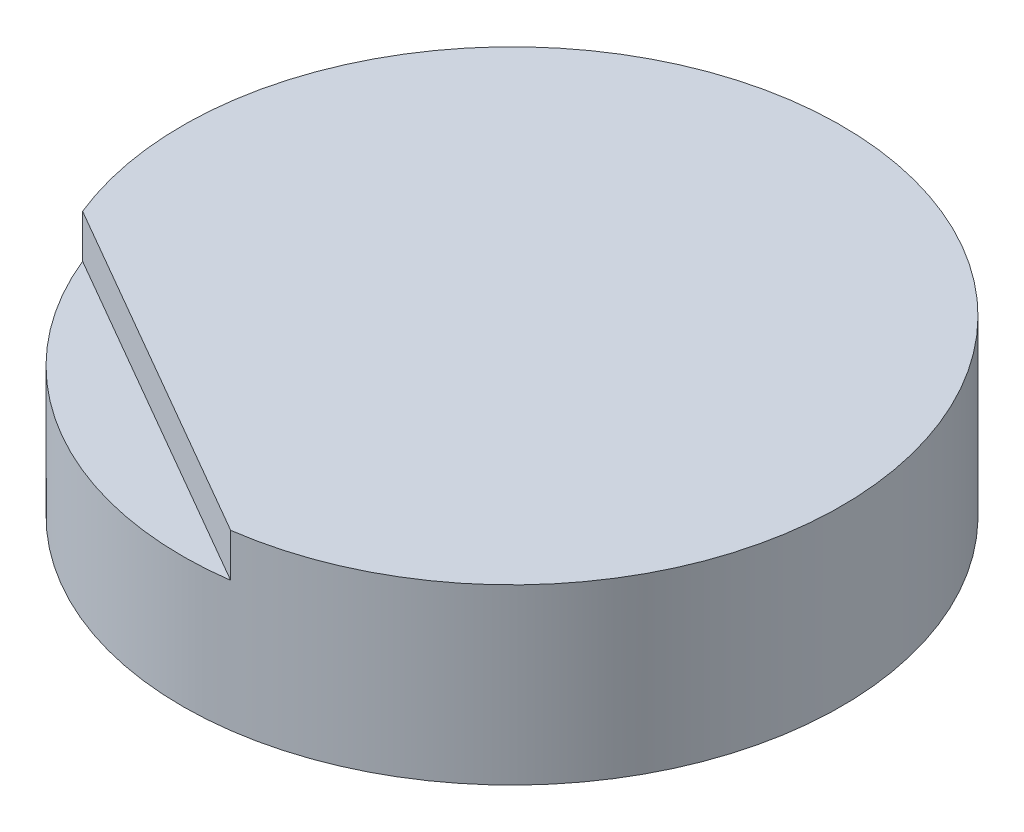
ISO-10303-21;
HEADER;
FILE_DESCRIPTION(('STEP AP214'),'2;1');
FILE_NAME('part.step','',(''),(''),'','','');
FILE_SCHEMA(('AUTOMOTIVE_DESIGN { 1 0 10303 214 1 1 1 1 }'));
ENDSEC;
DATA;
#1=APPLICATION_CONTEXT('core data for automotive mechanical design processes');
#2=APPLICATION_PROTOCOL_DEFINITION('international standard','automotive_design',2000,#1);
#3=PRODUCT_CONTEXT('',#1,'mechanical');
#4=PRODUCT('Part','Part','',(#3));
#5=PRODUCT_RELATED_PRODUCT_CATEGORY('part','',(#4));
#6=PRODUCT_DEFINITION_FORMATION('','',#4);
#7=PRODUCT_DEFINITION_CONTEXT('part definition',#1,'design');
#8=PRODUCT_DEFINITION('design','',#6,#7);
#9=PRODUCT_DEFINITION_SHAPE('','',#8);
#10=(LENGTH_UNIT() NAMED_UNIT(*) SI_UNIT(.MILLI.,.METRE.));
#11=(NAMED_UNIT(*) PLANE_ANGLE_UNIT() SI_UNIT($,.RADIAN.));
#12=(NAMED_UNIT(*) SI_UNIT($,.STERADIAN.) SOLID_ANGLE_UNIT());
#13=UNCERTAINTY_MEASURE_WITH_UNIT(LENGTH_MEASURE(1.E-05),#10,'distance_accuracy_value','');
#14=(GEOMETRIC_REPRESENTATION_CONTEXT(3) GLOBAL_UNCERTAINTY_ASSIGNED_CONTEXT((#13)) GLOBAL_UNIT_ASSIGNED_CONTEXT((#10,
#11,#12)) REPRESENTATION_CONTEXT('',''));
#15=CARTESIAN_POINT('',(0.,0.,0.));
#16=DIRECTION('',(0.,0.,1.));
#17=DIRECTION('',(1.,0.,0.));
#18=AXIS2_PLACEMENT_3D('',#15,#16,#17);
#19=CARTESIAN_POINT('',(-71.2916512459885,-69.5,25.9807621135332));
#20=DIRECTION('',(0.,1.,0.));
#21=DIRECTION('',(0.,0.,1.));
#22=AXIS2_PLACEMENT_3D('',#19,#20,#21);
#23=CYLINDRICAL_SURFACE('',#22,3.80000000000001);
#24=CARTESIAN_POINT('',(-71.2916512459885,-69.,25.9807621135332));
#25=DIRECTION('',(0.,-1.,0.));
#26=DIRECTION('',(0.,0.,-1.));
#27=AXIS2_PLACEMENT_3D('',#24,#25,#26);
#28=CIRCLE('',#27,3.80000000000001);
#29=CARTESIAN_POINT('',(-74.8115522336609,-69.,27.4126479459174));
#30=VERTEX_POINT('',#29);
#31=CARTESIAN_POINT('',(-70.7717502583161,-69.,29.7450287038555));
#32=VERTEX_POINT('',#31);
#33=EDGE_CURVE('E82',#30,#32,#28,.T.);
#34=ORIENTED_EDGE('',*,*,#33,.T.);
#35=DIRECTION('',(0.,1.,0.));
#36=VECTOR('',#35,1.);
#37=CARTESIAN_POINT('',(-70.7717502583161,-69.5,29.7450287038555));
#38=LINE('',#37,#36);
#39=CARTESIAN_POINT('',(-70.7717502583161,-69.5,29.7450287038555));
#40=VERTEX_POINT('',#39);
#41=EDGE_CURVE('E11',#40,#32,#38,.T.);
#42=ORIENTED_EDGE('',*,*,#41,.F.);
#43=CARTESIAN_POINT('',(-71.2916512459885,-69.5,25.9807621135332));
#44=DIRECTION('',(0.,-1.,0.));
#45=DIRECTION('',(0.,0.,-1.));
#46=AXIS2_PLACEMENT_3D('',#43,#44,#45);
#47=CIRCLE('',#46,3.8);
#48=CARTESIAN_POINT('',(-74.8115522336609,-69.5,27.4126479459174));
#49=VERTEX_POINT('',#48);
#50=EDGE_CURVE('E73',#40,#49,#47,.T.);
#51=ORIENTED_EDGE('',*,*,#50,.T.);
#52=DIRECTION('',(0.,1.,0.));
#53=VECTOR('',#52,1.);
#54=CARTESIAN_POINT('',(-74.8115522336609,-69.5,27.4126479459174));
#55=LINE('',#54,#53);
#56=EDGE_CURVE('E49',#49,#30,#55,.T.);
#57=ORIENTED_EDGE('',*,*,#56,.T.);
#58=EDGE_LOOP('',(#34,#42,#51,#57));
#59=FACE_BOUND('',#58,.T.);
#60=CARTESIAN_POINT('',(-71.2916512459885,-71.,25.9807621135332));
#61=DIRECTION('',(0.,-1.,0.));
#62=DIRECTION('',(0.,0.,-1.));
#63=AXIS2_PLACEMENT_3D('',#60,#61,#62);
#64=CIRCLE('',#63,3.8);
#65=CARTESIAN_POINT('',(-71.2916512459885,-71.,22.1807621135332));
#66=VERTEX_POINT('',#65);
#67=EDGE_CURVE('E79',#66,#66,#64,.T.);
#68=ORIENTED_EDGE('',*,*,#67,.F.);
#69=EDGE_LOOP('',(#68));
#70=FACE_BOUND('',#69,.T.);
#71=ADVANCED_FACE('F41',(#59,#70),#23,.T.);
#72=CARTESIAN_POINT('',(-70.7717502583161,-69.5,29.7450287038555));
#73=DIRECTION('',(0.499999999999999,0.,-0.866025403784439));
#74=DIRECTION('',(-0.866025403784439,0.,-0.499999999999999));
#75=AXIS2_PLACEMENT_3D('',#72,#73,#74);
#76=PLANE('',#75);
#77=DIRECTION('',(-0.866025403784439,0.,-0.499999999999999));
#78=VECTOR('',#77,1.);
#79=CARTESIAN_POINT('',(-70.7717502583161,-69.,29.7450287038555));
#80=LINE('',#79,#78);
#81=EDGE_CURVE('E65',#32,#30,#80,.T.);
#82=ORIENTED_EDGE('',*,*,#81,.T.);
#83=ORIENTED_EDGE('',*,*,#56,.F.);
#84=DIRECTION('',(-0.866025403784439,0.,-0.499999999999999));
#85=VECTOR('',#84,1.);
#86=CARTESIAN_POINT('',(-70.7717502583161,-69.5,29.7450287038555));
#87=LINE('',#86,#85);
#88=EDGE_CURVE('E57',#40,#49,#87,.T.);
#89=ORIENTED_EDGE('',*,*,#88,.F.);
#90=ORIENTED_EDGE('',*,*,#41,.T.);
#91=EDGE_LOOP('',(#82,#83,#89,#90));
#92=FACE_BOUND('',#91,.T.);
#93=ADVANCED_FACE('F70',(#92),#76,.F.);
#94=CARTESIAN_POINT('',(-71.2916512459885,-69.,25.9807621135332));
#95=DIRECTION('',(0.,-1.,0.));
#96=DIRECTION('',(0.,0.,-1.));
#97=AXIS2_PLACEMENT_3D('',#94,#95,#96);
#98=PLANE('',#97);
#99=ORIENTED_EDGE('',*,*,#33,.F.);
#100=ORIENTED_EDGE('',*,*,#81,.F.);
#101=EDGE_LOOP('',(#99,#100));
#102=FACE_BOUND('',#101,.T.);
#103=ADVANCED_FACE('F88',(#102),#98,.F.);
#104=CARTESIAN_POINT('',(-71.2916512459885,-69.5,25.9807621135332));
#105=DIRECTION('',(0.,-1.,0.));
#106=DIRECTION('',(0.,0.,-1.));
#107=AXIS2_PLACEMENT_3D('',#104,#105,#106);
#108=PLANE('',#107);
#109=ORIENTED_EDGE('',*,*,#50,.F.);
#110=ORIENTED_EDGE('',*,*,#88,.T.);
#111=EDGE_LOOP('',(#109,#110));
#112=FACE_BOUND('',#111,.T.);
#113=ADVANCED_FACE('F74',(#112),#108,.F.);
#114=CARTESIAN_POINT('',(-71.2916512459885,-71.,25.9807621135332));
#115=DIRECTION('',(0.,-1.,0.));
#116=DIRECTION('',(0.,0.,-1.));
#117=AXIS2_PLACEMENT_3D('',#114,#115,#116);
#118=PLANE('',#117);
#119=CARTESIAN_POINT('',(-71.2916512459885,-71.,25.9807621135332));
#120=DIRECTION('',(0.,-1.,0.));
#121=DIRECTION('',(0.,0.,-1.));
#122=AXIS2_PLACEMENT_3D('',#119,#120,#121);
#123=CIRCLE('',#122,2.36854385646542);
#124=CARTESIAN_POINT('',(-71.2916512459885,-71.,23.6122182570677));
#125=VERTEX_POINT('',#124);
#126=EDGE_CURVE('E42',#125,#125,#123,.T.);
#127=ORIENTED_EDGE('',*,*,#126,.F.);
#128=EDGE_LOOP('',(#127));
#129=FACE_BOUND('',#128,.T.);
#130=ORIENTED_EDGE('',*,*,#67,.T.);
#131=EDGE_LOOP('',(#130));
#132=FACE_BOUND('',#131,.T.);
#133=ADVANCED_FACE('F91',(#129,#132),#118,.T.);
#134=CARTESIAN_POINT('',(-71.2916512459885,-73.,25.9807621135332));
#135=DIRECTION('',(0.,0.,-1.));
#136=DIRECTION('',(-1.,0.,0.));
#137=AXIS2_PLACEMENT_3D('',#134,#135,#136);
#138=SPHERICAL_SURFACE('',#137,3.1);
#139=CARTESIAN_POINT('',(-71.2916512459885,-73.,25.9807621135332));
#140=DIRECTION('',(0.,-1.,0.));
#141=DIRECTION('',(0.,0.,-1.));
#142=AXIS2_PLACEMENT_3D('',#139,#140,#141);
#143=SPHERICAL_SURFACE('',#142,3.1);
#144=ORIENTED_EDGE('',*,*,#126,.T.);
#145=EDGE_LOOP('',(#144));
#146=FACE_BOUND('',#145,.T.);
#147=ADVANCED_FACE('F113',(#146),#143,.F.);
#148=CLOSED_SHELL('',(#71,#93,#103,#113,#133,#147));
#149=MANIFOLD_SOLID_BREP('B2',#148);
#150=ADVANCED_BREP_SHAPE_REPRESENTATION('',(#18,#149),#14);
#151=SHAPE_DEFINITION_REPRESENTATION(#9,#150);
ENDSEC;
END-ISO-10303-21;
